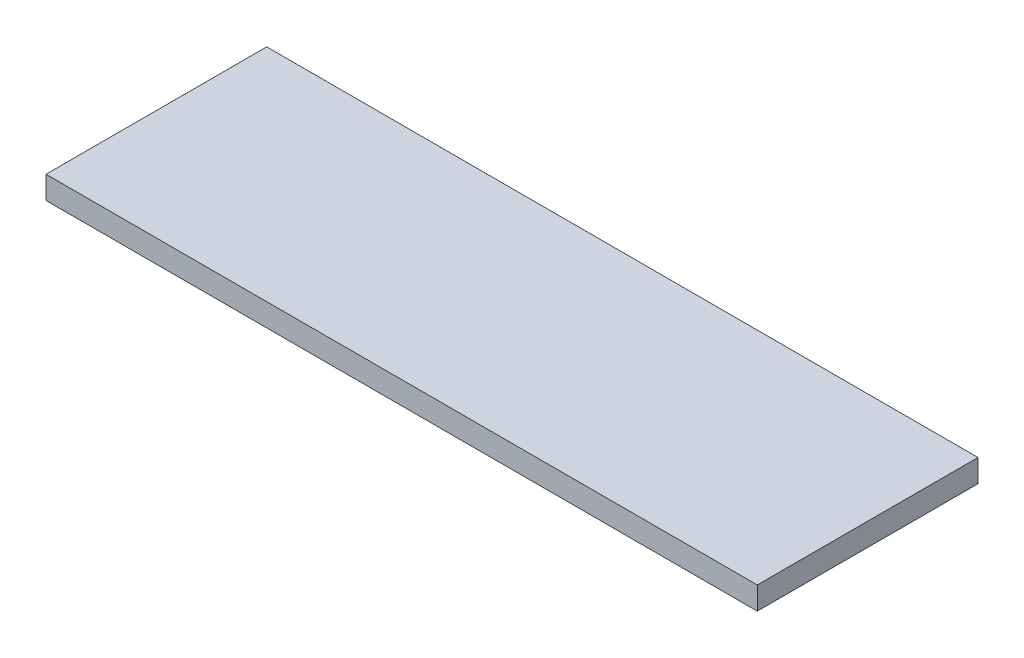
ISO-10303-21;
HEADER;
FILE_DESCRIPTION(('STEP AP214'),'2;1');
FILE_NAME('part.step','',(''),(''),'','','');
FILE_SCHEMA(('AUTOMOTIVE_DESIGN { 1 0 10303 214 1 1 1 1 }'));
ENDSEC;
DATA;
#1=APPLICATION_CONTEXT('core data for automotive mechanical design processes');
#2=APPLICATION_PROTOCOL_DEFINITION('international standard','automotive_design',2000,#1);
#3=PRODUCT_CONTEXT('',#1,'mechanical');
#4=PRODUCT('Part','Part','',(#3));
#5=PRODUCT_RELATED_PRODUCT_CATEGORY('part','',(#4));
#6=PRODUCT_DEFINITION_FORMATION('','',#4);
#7=PRODUCT_DEFINITION_CONTEXT('part definition',#1,'design');
#8=PRODUCT_DEFINITION('design','',#6,#7);
#9=PRODUCT_DEFINITION_SHAPE('','',#8);
#10=(LENGTH_UNIT() NAMED_UNIT(*) SI_UNIT(.MILLI.,.METRE.));
#11=(NAMED_UNIT(*) PLANE_ANGLE_UNIT() SI_UNIT($,.RADIAN.));
#12=(NAMED_UNIT(*) SI_UNIT($,.STERADIAN.) SOLID_ANGLE_UNIT());
#13=UNCERTAINTY_MEASURE_WITH_UNIT(LENGTH_MEASURE(1.E-05),#10,'distance_accuracy_value','');
#14=(GEOMETRIC_REPRESENTATION_CONTEXT(3) GLOBAL_UNCERTAINTY_ASSIGNED_CONTEXT((#13)) GLOBAL_UNIT_ASSIGNED_CONTEXT((#10,
#11,#12)) REPRESENTATION_CONTEXT('',''));
#15=CARTESIAN_POINT('',(0.,0.,0.));
#16=DIRECTION('',(0.,0.,1.));
#17=DIRECTION('',(1.,0.,0.));
#18=AXIS2_PLACEMENT_3D('',#15,#16,#17);
#19=CARTESIAN_POINT('',(0.,18.,0.));
#20=DIRECTION('',(-1.,0.,0.));
#21=DIRECTION('',(0.,0.,1.));
#22=AXIS2_PLACEMENT_3D('',#19,#20,#21);
#23=PLANE('',#22);
#24=DIRECTION('',(0.,0.,-1.));
#25=VECTOR('',#24,1.);
#26=CARTESIAN_POINT('',(0.,0.,0.));
#27=LINE('',#26,#25);
#28=CARTESIAN_POINT('',(0.,0.,0.));
#29=VERTEX_POINT('',#28);
#30=CARTESIAN_POINT('',(0.,0.,-175.));
#31=VERTEX_POINT('',#30);
#32=EDGE_CURVE('E95',#29,#31,#27,.T.);
#33=ORIENTED_EDGE('',*,*,#32,.T.);
#34=DIRECTION('',(0.,-1.,0.));
#35=VECTOR('',#34,1.);
#36=CARTESIAN_POINT('',(0.,18.,-175.));
#37=LINE('',#36,#35);
#38=CARTESIAN_POINT('',(0.,18.,-175.));
#39=VERTEX_POINT('',#38);
#40=EDGE_CURVE('E11',#39,#31,#37,.T.);
#41=ORIENTED_EDGE('',*,*,#40,.F.);
#42=DIRECTION('',(0.,0.,-1.));
#43=VECTOR('',#42,1.);
#44=CARTESIAN_POINT('',(0.,18.,0.));
#45=LINE('',#44,#43);
#46=CARTESIAN_POINT('',(0.,18.,0.));
#47=VERTEX_POINT('',#46);
#48=EDGE_CURVE('E83',#47,#39,#45,.T.);
#49=ORIENTED_EDGE('',*,*,#48,.F.);
#50=DIRECTION('',(0.,-1.,0.));
#51=VECTOR('',#50,1.);
#52=CARTESIAN_POINT('',(0.,18.,0.));
#53=LINE('',#52,#51);
#54=EDGE_CURVE('E91',#47,#29,#53,.T.);
#55=ORIENTED_EDGE('',*,*,#54,.T.);
#56=EDGE_LOOP('',(#33,#41,#49,#55));
#57=FACE_BOUND('',#56,.T.);
#58=ADVANCED_FACE('F32',(#57),#23,.F.);
#59=CARTESIAN_POINT('',(0.,18.,-175.));
#60=DIRECTION('',(0.,0.,1.));
#61=DIRECTION('',(1.,0.,0.));
#62=AXIS2_PLACEMENT_3D('',#59,#60,#61);
#63=PLANE('',#62);
#64=DIRECTION('',(-1.,0.,0.));
#65=VECTOR('',#64,1.);
#66=CARTESIAN_POINT('',(0.,0.,-175.));
#67=LINE('',#66,#65);
#68=CARTESIAN_POINT('',(-564.,0.,-175.));
#69=VERTEX_POINT('',#68);
#70=EDGE_CURVE('E87',#31,#69,#67,.T.);
#71=ORIENTED_EDGE('',*,*,#70,.T.);
#72=DIRECTION('',(0.,-1.,0.));
#73=VECTOR('',#72,1.);
#74=CARTESIAN_POINT('',(-564.,18.,-175.));
#75=LINE('',#74,#73);
#76=CARTESIAN_POINT('',(-564.,18.,-175.));
#77=VERTEX_POINT('',#76);
#78=EDGE_CURVE('E40',#77,#69,#75,.T.);
#79=ORIENTED_EDGE('',*,*,#78,.F.);
#80=DIRECTION('',(-1.,0.,0.));
#81=VECTOR('',#80,1.);
#82=CARTESIAN_POINT('',(0.,18.,-175.));
#83=LINE('',#82,#81);
#84=EDGE_CURVE('E78',#39,#77,#83,.T.);
#85=ORIENTED_EDGE('',*,*,#84,.F.);
#86=ORIENTED_EDGE('',*,*,#40,.T.);
#87=EDGE_LOOP('',(#71,#79,#85,#86));
#88=FACE_BOUND('',#87,.T.);
#89=ADVANCED_FACE('F86',(#88),#63,.F.);
#90=CARTESIAN_POINT('',(-564.,18.,0.));
#91=DIRECTION('',(1.,0.,0.));
#92=DIRECTION('',(0.,0.,-1.));
#93=AXIS2_PLACEMENT_3D('',#90,#91,#92);
#94=PLANE('',#93);
#95=DIRECTION('',(0.,0.,1.));
#96=VECTOR('',#95,1.);
#97=CARTESIAN_POINT('',(-564.,0.,0.));
#98=LINE('',#97,#96);
#99=CARTESIAN_POINT('',(-564.,0.,0.));
#100=VERTEX_POINT('',#99);
#101=EDGE_CURVE('E65',#69,#100,#98,.T.);
#102=ORIENTED_EDGE('',*,*,#101,.T.);
#103=DIRECTION('',(0.,-1.,0.));
#104=VECTOR('',#103,1.);
#105=CARTESIAN_POINT('',(-564.,18.,0.));
#106=LINE('',#105,#104);
#107=CARTESIAN_POINT('',(-564.,18.,0.));
#108=VERTEX_POINT('',#107);
#109=EDGE_CURVE('E88',#108,#100,#106,.T.);
#110=ORIENTED_EDGE('',*,*,#109,.F.);
#111=DIRECTION('',(0.,0.,1.));
#112=VECTOR('',#111,1.);
#113=CARTESIAN_POINT('',(-564.,18.,0.));
#114=LINE('',#113,#112);
#115=EDGE_CURVE('E81',#77,#108,#114,.T.);
#116=ORIENTED_EDGE('',*,*,#115,.F.);
#117=ORIENTED_EDGE('',*,*,#78,.T.);
#118=EDGE_LOOP('',(#102,#110,#116,#117));
#119=FACE_BOUND('',#118,.T.);
#120=ADVANCED_FACE('F89',(#119),#94,.F.);
#121=CARTESIAN_POINT('',(0.,18.,0.));
#122=DIRECTION('',(0.,0.,-1.));
#123=DIRECTION('',(-1.,0.,0.));
#124=AXIS2_PLACEMENT_3D('',#121,#122,#123);
#125=PLANE('',#124);
#126=DIRECTION('',(1.,0.,0.));
#127=VECTOR('',#126,1.);
#128=CARTESIAN_POINT('',(0.,0.,0.));
#129=LINE('',#128,#127);
#130=EDGE_CURVE('E71',#100,#29,#129,.T.);
#131=ORIENTED_EDGE('',*,*,#130,.T.);
#132=ORIENTED_EDGE('',*,*,#54,.F.);
#133=DIRECTION('',(1.,0.,0.));
#134=VECTOR('',#133,1.);
#135=CARTESIAN_POINT('',(0.,18.,0.));
#136=LINE('',#135,#134);
#137=EDGE_CURVE('E48',#108,#47,#136,.T.);
#138=ORIENTED_EDGE('',*,*,#137,.F.);
#139=ORIENTED_EDGE('',*,*,#109,.T.);
#140=EDGE_LOOP('',(#131,#132,#138,#139));
#141=FACE_BOUND('',#140,.T.);
#142=ADVANCED_FACE('F102',(#141),#125,.F.);
#143=CARTESIAN_POINT('',(0.,18.,0.));
#144=DIRECTION('',(0.,1.,0.));
#145=DIRECTION('',(0.,0.,1.));
#146=AXIS2_PLACEMENT_3D('',#143,#144,#145);
#147=PLANE('',#146);
#148=ORIENTED_EDGE('',*,*,#48,.T.);
#149=ORIENTED_EDGE('',*,*,#84,.T.);
#150=ORIENTED_EDGE('',*,*,#115,.T.);
#151=ORIENTED_EDGE('',*,*,#137,.T.);
#152=EDGE_LOOP('',(#148,#149,#150,#151));
#153=FACE_BOUND('',#152,.T.);
#154=ADVANCED_FACE('F79',(#153),#147,.T.);
#155=CARTESIAN_POINT('',(0.,0.,0.));
#156=DIRECTION('',(0.,1.,0.));
#157=DIRECTION('',(0.,0.,1.));
#158=AXIS2_PLACEMENT_3D('',#155,#156,#157);
#159=PLANE('',#158);
#160=ORIENTED_EDGE('',*,*,#32,.F.);
#161=ORIENTED_EDGE('',*,*,#130,.F.);
#162=ORIENTED_EDGE('',*,*,#101,.F.);
#163=ORIENTED_EDGE('',*,*,#70,.F.);
#164=EDGE_LOOP('',(#160,#161,#162,#163));
#165=FACE_BOUND('',#164,.T.);
#166=ADVANCED_FACE('F105',(#165),#159,.F.);
#167=CLOSED_SHELL('',(#58,#89,#120,#142,#154,#166));
#168=MANIFOLD_SOLID_BREP('B2',#167);
#169=ADVANCED_BREP_SHAPE_REPRESENTATION('',(#18,#168),#14);
#170=SHAPE_DEFINITION_REPRESENTATION(#9,#169);
ENDSEC;
END-ISO-10303-21;
